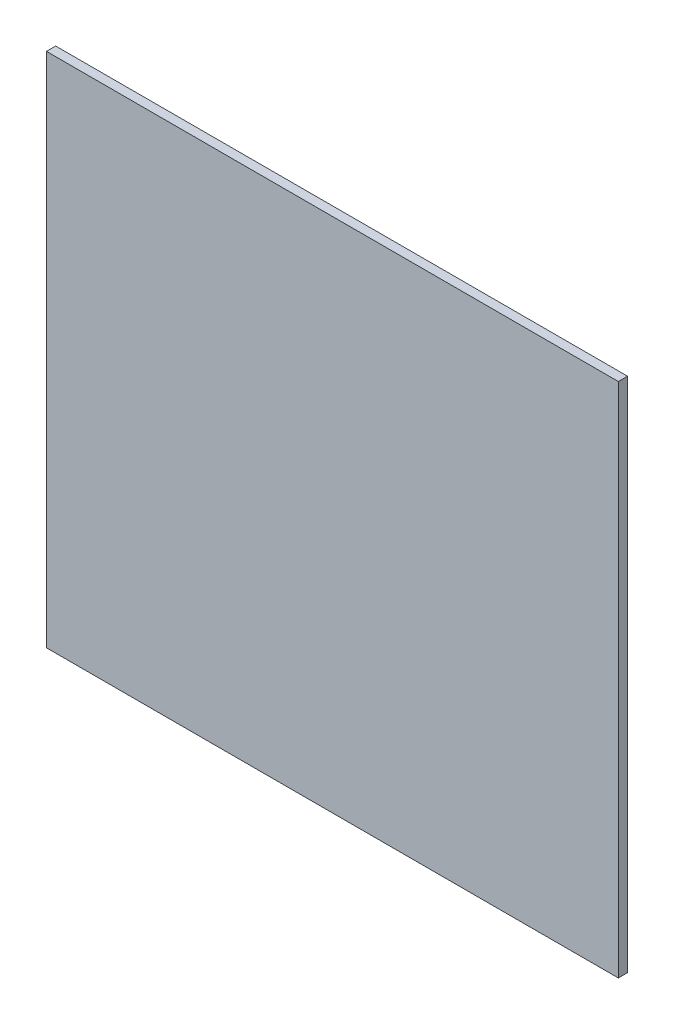
ISO-10303-21;
HEADER;
FILE_DESCRIPTION(('STEP AP214'),'2;1');
FILE_NAME('part.step','',(''),(''),'','','');
FILE_SCHEMA(('AUTOMOTIVE_DESIGN { 1 0 10303 214 1 1 1 1 }'));
ENDSEC;
DATA;
#1=APPLICATION_CONTEXT('core data for automotive mechanical design processes');
#2=APPLICATION_PROTOCOL_DEFINITION('international standard','automotive_design',2000,#1);
#3=PRODUCT_CONTEXT('',#1,'mechanical');
#4=PRODUCT('Part','Part','',(#3));
#5=PRODUCT_RELATED_PRODUCT_CATEGORY('part','',(#4));
#6=PRODUCT_DEFINITION_FORMATION('','',#4);
#7=PRODUCT_DEFINITION_CONTEXT('part definition',#1,'design');
#8=PRODUCT_DEFINITION('design','',#6,#7);
#9=PRODUCT_DEFINITION_SHAPE('','',#8);
#10=(LENGTH_UNIT() NAMED_UNIT(*) SI_UNIT(.MILLI.,.METRE.));
#11=(NAMED_UNIT(*) PLANE_ANGLE_UNIT() SI_UNIT($,.RADIAN.));
#12=(NAMED_UNIT(*) SI_UNIT($,.STERADIAN.) SOLID_ANGLE_UNIT());
#13=UNCERTAINTY_MEASURE_WITH_UNIT(LENGTH_MEASURE(1.E-05),#10,'distance_accuracy_value','');
#14=(GEOMETRIC_REPRESENTATION_CONTEXT(3) GLOBAL_UNCERTAINTY_ASSIGNED_CONTEXT((#13)) GLOBAL_UNIT_ASSIGNED_CONTEXT((#10,
#11,#12)) REPRESENTATION_CONTEXT('',''));
#15=CARTESIAN_POINT('',(0.,0.,0.));
#16=DIRECTION('',(0.,0.,1.));
#17=DIRECTION('',(1.,0.,0.));
#18=AXIS2_PLACEMENT_3D('',#15,#16,#17);
#19=CARTESIAN_POINT('',(155.,140.,5.));
#20=DIRECTION('',(-1.,0.,0.));
#21=DIRECTION('',(0.,-1.,0.));
#22=AXIS2_PLACEMENT_3D('',#19,#20,#21);
#23=PLANE('',#22);
#24=DIRECTION('',(0.,1.,0.));
#25=VECTOR('',#24,1.);
#26=CARTESIAN_POINT('',(155.,140.,0.));
#27=LINE('',#26,#25);
#28=CARTESIAN_POINT('',(155.,-140.,0.));
#29=VERTEX_POINT('',#28);
#30=CARTESIAN_POINT('',(155.,140.,0.));
#31=VERTEX_POINT('',#30);
#32=EDGE_CURVE('E96',#29,#31,#27,.T.);
#33=ORIENTED_EDGE('',*,*,#32,.T.);
#34=DIRECTION('',(0.,0.,-1.));
#35=VECTOR('',#34,1.);
#36=CARTESIAN_POINT('',(155.,140.,5.));
#37=LINE('',#36,#35);
#38=CARTESIAN_POINT('',(155.,140.,5.));
#39=VERTEX_POINT('',#38);
#40=EDGE_CURVE('E11',#39,#31,#37,.T.);
#41=ORIENTED_EDGE('',*,*,#40,.F.);
#42=DIRECTION('',(0.,1.,0.));
#43=VECTOR('',#42,1.);
#44=CARTESIAN_POINT('',(155.,140.,5.));
#45=LINE('',#44,#43);
#46=CARTESIAN_POINT('',(155.,-140.,5.));
#47=VERTEX_POINT('',#46);
#48=EDGE_CURVE('E84',#47,#39,#45,.T.);
#49=ORIENTED_EDGE('',*,*,#48,.F.);
#50=DIRECTION('',(0.,0.,-1.));
#51=VECTOR('',#50,1.);
#52=CARTESIAN_POINT('',(155.,-140.,5.));
#53=LINE('',#52,#51);
#54=EDGE_CURVE('E92',#47,#29,#53,.T.);
#55=ORIENTED_EDGE('',*,*,#54,.T.);
#56=EDGE_LOOP('',(#33,#41,#49,#55));
#57=FACE_BOUND('',#56,.T.);
#58=ADVANCED_FACE('F33',(#57),#23,.F.);
#59=CARTESIAN_POINT('',(-155.,140.,5.));
#60=DIRECTION('',(0.,-1.,0.));
#61=DIRECTION('',(0.,0.,-1.));
#62=AXIS2_PLACEMENT_3D('',#59,#60,#61);
#63=PLANE('',#62);
#64=DIRECTION('',(-1.,0.,0.));
#65=VECTOR('',#64,1.);
#66=CARTESIAN_POINT('',(-155.,140.,0.));
#67=LINE('',#66,#65);
#68=CARTESIAN_POINT('',(-155.,140.,0.));
#69=VERTEX_POINT('',#68);
#70=EDGE_CURVE('E88',#31,#69,#67,.T.);
#71=ORIENTED_EDGE('',*,*,#70,.T.);
#72=DIRECTION('',(0.,0.,-1.));
#73=VECTOR('',#72,1.);
#74=CARTESIAN_POINT('',(-155.,140.,5.));
#75=LINE('',#74,#73);
#76=CARTESIAN_POINT('',(-155.,140.,5.));
#77=VERTEX_POINT('',#76);
#78=EDGE_CURVE('E41',#77,#69,#75,.T.);
#79=ORIENTED_EDGE('',*,*,#78,.F.);
#80=DIRECTION('',(-1.,0.,0.));
#81=VECTOR('',#80,1.);
#82=CARTESIAN_POINT('',(-155.,140.,5.));
#83=LINE('',#82,#81);
#84=EDGE_CURVE('E79',#39,#77,#83,.T.);
#85=ORIENTED_EDGE('',*,*,#84,.F.);
#86=ORIENTED_EDGE('',*,*,#40,.T.);
#87=EDGE_LOOP('',(#71,#79,#85,#86));
#88=FACE_BOUND('',#87,.T.);
#89=ADVANCED_FACE('F87',(#88),#63,.F.);
#90=CARTESIAN_POINT('',(-155.,140.,5.));
#91=DIRECTION('',(1.,0.,0.));
#92=DIRECTION('',(0.,1.,0.));
#93=AXIS2_PLACEMENT_3D('',#90,#91,#92);
#94=PLANE('',#93);
#95=DIRECTION('',(0.,-1.,0.));
#96=VECTOR('',#95,1.);
#97=CARTESIAN_POINT('',(-155.,140.,0.));
#98=LINE('',#97,#96);
#99=CARTESIAN_POINT('',(-155.,-140.,0.));
#100=VERTEX_POINT('',#99);
#101=EDGE_CURVE('E66',#69,#100,#98,.T.);
#102=ORIENTED_EDGE('',*,*,#101,.T.);
#103=DIRECTION('',(0.,0.,-1.));
#104=VECTOR('',#103,1.);
#105=CARTESIAN_POINT('',(-155.,-140.,5.));
#106=LINE('',#105,#104);
#107=CARTESIAN_POINT('',(-155.,-140.,5.));
#108=VERTEX_POINT('',#107);
#109=EDGE_CURVE('E89',#108,#100,#106,.T.);
#110=ORIENTED_EDGE('',*,*,#109,.F.);
#111=DIRECTION('',(0.,-1.,0.));
#112=VECTOR('',#111,1.);
#113=CARTESIAN_POINT('',(-155.,140.,5.));
#114=LINE('',#113,#112);
#115=EDGE_CURVE('E82',#77,#108,#114,.T.);
#116=ORIENTED_EDGE('',*,*,#115,.F.);
#117=ORIENTED_EDGE('',*,*,#78,.T.);
#118=EDGE_LOOP('',(#102,#110,#116,#117));
#119=FACE_BOUND('',#118,.T.);
#120=ADVANCED_FACE('F90',(#119),#94,.F.);
#121=CARTESIAN_POINT('',(-155.,-140.,5.));
#122=DIRECTION('',(0.,1.,0.));
#123=DIRECTION('',(0.,0.,1.));
#124=AXIS2_PLACEMENT_3D('',#121,#122,#123);
#125=PLANE('',#124);
#126=DIRECTION('',(1.,0.,0.));
#127=VECTOR('',#126,1.);
#128=CARTESIAN_POINT('',(-155.,-140.,0.));
#129=LINE('',#128,#127);
#130=EDGE_CURVE('E72',#100,#29,#129,.T.);
#131=ORIENTED_EDGE('',*,*,#130,.T.);
#132=ORIENTED_EDGE('',*,*,#54,.F.);
#133=DIRECTION('',(1.,0.,0.));
#134=VECTOR('',#133,1.);
#135=CARTESIAN_POINT('',(-155.,-140.,5.));
#136=LINE('',#135,#134);
#137=EDGE_CURVE('E49',#108,#47,#136,.T.);
#138=ORIENTED_EDGE('',*,*,#137,.F.);
#139=ORIENTED_EDGE('',*,*,#109,.T.);
#140=EDGE_LOOP('',(#131,#132,#138,#139));
#141=FACE_BOUND('',#140,.T.);
#142=ADVANCED_FACE('F103',(#141),#125,.F.);
#143=CARTESIAN_POINT('',(0.,0.,5.));
#144=DIRECTION('',(0.,0.,1.));
#145=DIRECTION('',(1.,0.,0.));
#146=AXIS2_PLACEMENT_3D('',#143,#144,#145);
#147=PLANE('',#146);
#148=ORIENTED_EDGE('',*,*,#48,.T.);
#149=ORIENTED_EDGE('',*,*,#84,.T.);
#150=ORIENTED_EDGE('',*,*,#115,.T.);
#151=ORIENTED_EDGE('',*,*,#137,.T.);
#152=EDGE_LOOP('',(#148,#149,#150,#151));
#153=FACE_BOUND('',#152,.T.);
#154=ADVANCED_FACE('F80',(#153),#147,.T.);
#155=CARTESIAN_POINT('',(0.,0.,0.));
#156=DIRECTION('',(0.,0.,1.));
#157=DIRECTION('',(1.,0.,0.));
#158=AXIS2_PLACEMENT_3D('',#155,#156,#157);
#159=PLANE('',#158);
#160=ORIENTED_EDGE('',*,*,#32,.F.);
#161=ORIENTED_EDGE('',*,*,#130,.F.);
#162=ORIENTED_EDGE('',*,*,#101,.F.);
#163=ORIENTED_EDGE('',*,*,#70,.F.);
#164=EDGE_LOOP('',(#160,#161,#162,#163));
#165=FACE_BOUND('',#164,.T.);
#166=ADVANCED_FACE('F106',(#165),#159,.F.);
#167=CLOSED_SHELL('',(#58,#89,#120,#142,#154,#166));
#168=MANIFOLD_SOLID_BREP('B2',#167);
#169=ADVANCED_BREP_SHAPE_REPRESENTATION('',(#18,#168),#14);
#170=SHAPE_DEFINITION_REPRESENTATION(#9,#169);
ENDSEC;
END-ISO-10303-21;
